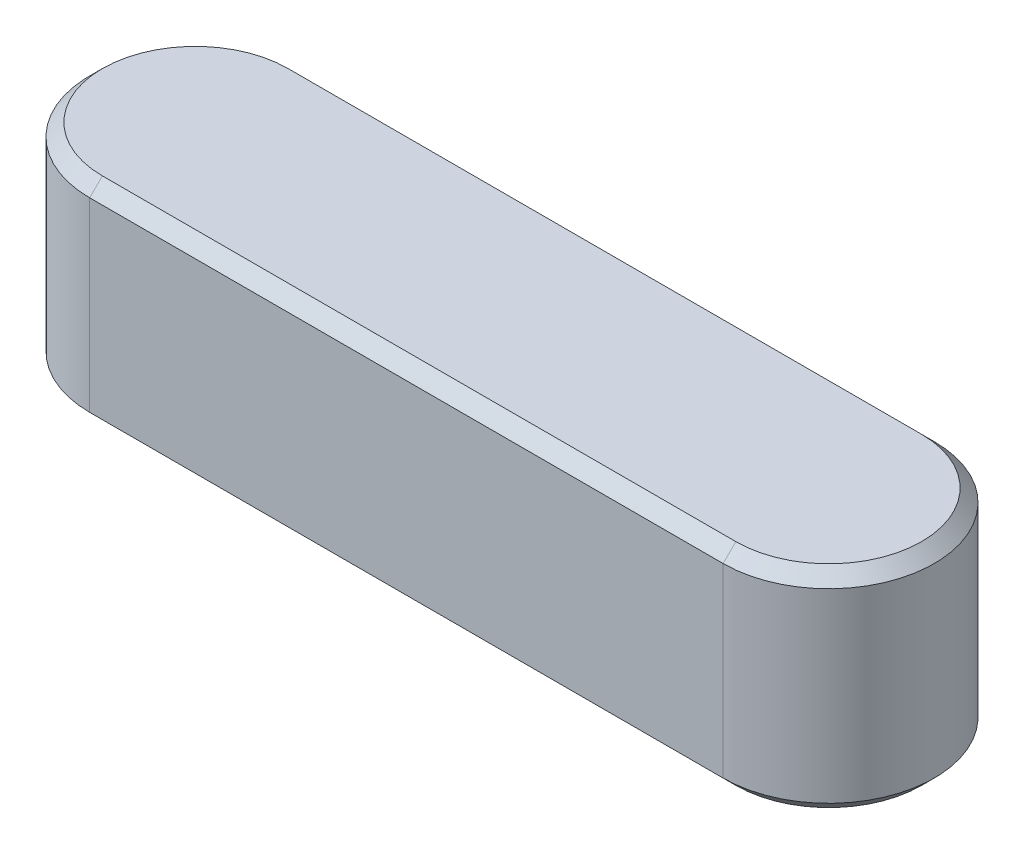
ISO-10303-21;
HEADER;
FILE_DESCRIPTION(('STEP AP214'),'2;1');
FILE_NAME('part.step','',(''),(''),'','','');
FILE_SCHEMA(('AUTOMOTIVE_DESIGN { 1 0 10303 214 1 1 1 1 }'));
ENDSEC;
DATA;
#1=APPLICATION_CONTEXT('core data for automotive mechanical design processes');
#2=APPLICATION_PROTOCOL_DEFINITION('international standard','automotive_design',2000,#1);
#3=PRODUCT_CONTEXT('',#1,'mechanical');
#4=PRODUCT('Part','Part','',(#3));
#5=PRODUCT_RELATED_PRODUCT_CATEGORY('part','',(#4));
#6=PRODUCT_DEFINITION_FORMATION('','',#4);
#7=PRODUCT_DEFINITION_CONTEXT('part definition',#1,'design');
#8=PRODUCT_DEFINITION('design','',#6,#7);
#9=PRODUCT_DEFINITION_SHAPE('','',#8);
#10=(LENGTH_UNIT() NAMED_UNIT(*) SI_UNIT(.MILLI.,.METRE.));
#11=(NAMED_UNIT(*) PLANE_ANGLE_UNIT() SI_UNIT($,.RADIAN.));
#12=(NAMED_UNIT(*) SI_UNIT($,.STERADIAN.) SOLID_ANGLE_UNIT());
#13=UNCERTAINTY_MEASURE_WITH_UNIT(LENGTH_MEASURE(1.E-05),#10,'distance_accuracy_value','');
#14=(GEOMETRIC_REPRESENTATION_CONTEXT(3) GLOBAL_UNCERTAINTY_ASSIGNED_CONTEXT((#13)) GLOBAL_UNIT_ASSIGNED_CONTEXT((#10,
#11,#12)) REPRESENTATION_CONTEXT('',''));
#15=CARTESIAN_POINT('',(0.,0.,0.));
#16=DIRECTION('',(0.,0.,1.));
#17=DIRECTION('',(1.,0.,0.));
#18=AXIS2_PLACEMENT_3D('',#15,#16,#17);
#19=CARTESIAN_POINT('',(0.,5.,0.));
#20=DIRECTION('',(0.,-1.,0.));
#21=DIRECTION('',(0.,0.,-1.));
#22=AXIS2_PLACEMENT_3D('',#19,#20,#21);
#23=CYLINDRICAL_SURFACE('',#22,2.5);
#24=DIRECTION('',(0.,-1.,0.));
#25=VECTOR('',#24,1.);
#26=CARTESIAN_POINT('',(0.,5.,-2.5));
#27=LINE('',#26,#25);
#28=CARTESIAN_POINT('',(0.,4.7,-2.5));
#29=VERTEX_POINT('',#28);
#30=CARTESIAN_POINT('',(0.,0.299999999999999,-2.5));
#31=VERTEX_POINT('',#30);
#32=EDGE_CURVE('E142',#29,#31,#27,.T.);
#33=ORIENTED_EDGE('',*,*,#32,.T.);
#34=CARTESIAN_POINT('',(0.,0.299999999999999,0.));
#35=DIRECTION('',(0.,1.,0.));
#36=DIRECTION('',(0.,0.,1.));
#37=AXIS2_PLACEMENT_3D('',#34,#35,#36);
#38=CIRCLE('',#37,2.5);
#39=CARTESIAN_POINT('',(0.,0.299999999999999,2.5));
#40=VERTEX_POINT('',#39);
#41=EDGE_CURVE('E151',#31,#40,#38,.T.);
#42=ORIENTED_EDGE('',*,*,#41,.T.);
#43=DIRECTION('',(0.,-1.,0.));
#44=VECTOR('',#43,1.);
#45=CARTESIAN_POINT('',(0.,5.,2.5));
#46=LINE('',#45,#44);
#47=CARTESIAN_POINT('',(0.,4.7,2.5));
#48=VERTEX_POINT('',#47);
#49=EDGE_CURVE('E120',#48,#40,#46,.T.);
#50=ORIENTED_EDGE('',*,*,#49,.F.);
#51=CARTESIAN_POINT('',(0.,4.7,0.));
#52=DIRECTION('',(0.,1.,0.));
#53=DIRECTION('',(0.,0.,1.));
#54=AXIS2_PLACEMENT_3D('',#51,#52,#53);
#55=CIRCLE('',#54,2.5);
#56=EDGE_CURVE('E153',#48,#29,#55,.F.);
#57=ORIENTED_EDGE('',*,*,#56,.T.);
#58=EDGE_LOOP('',(#33,#42,#50,#57));
#59=FACE_BOUND('',#58,.T.);
#60=ADVANCED_FACE('F33',(#59),#23,.T.);
#61=CARTESIAN_POINT('',(0.,5.,2.5));
#62=DIRECTION('',(0.,0.,-1.));
#63=DIRECTION('',(-1.,0.,0.));
#64=AXIS2_PLACEMENT_3D('',#61,#62,#63);
#65=PLANE('',#64);
#66=ORIENTED_EDGE('',*,*,#49,.T.);
#67=DIRECTION('',(1.,0.,0.));
#68=VECTOR('',#67,1.);
#69=CARTESIAN_POINT('',(0.,0.299999999999999,2.5));
#70=LINE('',#69,#68);
#71=CARTESIAN_POINT('',(15.,0.299999999999999,2.5));
#72=VERTEX_POINT('',#71);
#73=EDGE_CURVE('E119',#40,#72,#70,.T.);
#74=ORIENTED_EDGE('',*,*,#73,.T.);
#75=DIRECTION('',(0.,-1.,0.));
#76=VECTOR('',#75,1.);
#77=CARTESIAN_POINT('',(15.,5.,2.5));
#78=LINE('',#77,#76);
#79=CARTESIAN_POINT('',(15.,4.7,2.5));
#80=VERTEX_POINT('',#79);
#81=EDGE_CURVE('E102',#80,#72,#78,.T.);
#82=ORIENTED_EDGE('',*,*,#81,.F.);
#83=DIRECTION('',(-1.,0.,0.));
#84=VECTOR('',#83,1.);
#85=CARTESIAN_POINT('',(0.,4.7,2.5));
#86=LINE('',#85,#84);
#87=EDGE_CURVE('E116',#80,#48,#86,.T.);
#88=ORIENTED_EDGE('',*,*,#87,.T.);
#89=EDGE_LOOP('',(#66,#74,#82,#88));
#90=FACE_BOUND('',#89,.T.);
#91=ADVANCED_FACE('F115',(#90),#65,.F.);
#92=CARTESIAN_POINT('',(15.,5.,0.));
#93=DIRECTION('',(0.,-1.,0.));
#94=DIRECTION('',(0.,0.,-1.));
#95=AXIS2_PLACEMENT_3D('',#92,#93,#94);
#96=CYLINDRICAL_SURFACE('',#95,2.5);
#97=ORIENTED_EDGE('',*,*,#81,.T.);
#98=CARTESIAN_POINT('',(15.,0.299999999999999,0.));
#99=DIRECTION('',(0.,1.,0.));
#100=DIRECTION('',(0.,0.,1.));
#101=AXIS2_PLACEMENT_3D('',#98,#99,#100);
#102=CIRCLE('',#101,2.5);
#103=CARTESIAN_POINT('',(15.,0.299999999999999,-2.5));
#104=VERTEX_POINT('',#103);
#105=EDGE_CURVE('E108',#72,#104,#102,.T.);
#106=ORIENTED_EDGE('',*,*,#105,.T.);
#107=DIRECTION('',(0.,-1.,0.));
#108=VECTOR('',#107,1.);
#109=CARTESIAN_POINT('',(15.,5.,-2.5));
#110=LINE('',#109,#108);
#111=CARTESIAN_POINT('',(15.,4.7,-2.5));
#112=VERTEX_POINT('',#111);
#113=EDGE_CURVE('E104',#112,#104,#110,.T.);
#114=ORIENTED_EDGE('',*,*,#113,.F.);
#115=CARTESIAN_POINT('',(15.,4.7,0.));
#116=DIRECTION('',(0.,1.,0.));
#117=DIRECTION('',(0.,0.,1.));
#118=AXIS2_PLACEMENT_3D('',#115,#116,#117);
#119=CIRCLE('',#118,2.5);
#120=EDGE_CURVE('E99',#112,#80,#119,.F.);
#121=ORIENTED_EDGE('',*,*,#120,.T.);
#122=EDGE_LOOP('',(#97,#106,#114,#121));
#123=FACE_BOUND('',#122,.T.);
#124=ADVANCED_FACE('F101',(#123),#96,.T.);
#125=CARTESIAN_POINT('',(0.,5.,-2.5));
#126=DIRECTION('',(0.,0.,1.));
#127=DIRECTION('',(1.,0.,0.));
#128=AXIS2_PLACEMENT_3D('',#125,#126,#127);
#129=PLANE('',#128);
#130=ORIENTED_EDGE('',*,*,#113,.T.);
#131=DIRECTION('',(-1.,0.,0.));
#132=VECTOR('',#131,1.);
#133=CARTESIAN_POINT('',(0.,0.299999999999999,-2.5));
#134=LINE('',#133,#132);
#135=EDGE_CURVE('E155',#104,#31,#134,.T.);
#136=ORIENTED_EDGE('',*,*,#135,.T.);
#137=ORIENTED_EDGE('',*,*,#32,.F.);
#138=DIRECTION('',(1.,0.,0.));
#139=VECTOR('',#138,1.);
#140=CARTESIAN_POINT('',(15.,4.7,-2.5));
#141=LINE('',#140,#139);
#142=EDGE_CURVE('E157',#29,#112,#141,.T.);
#143=ORIENTED_EDGE('',*,*,#142,.T.);
#144=EDGE_LOOP('',(#130,#136,#137,#143));
#145=FACE_BOUND('',#144,.T.);
#146=ADVANCED_FACE('F195',(#145),#129,.F.);
#147=CARTESIAN_POINT('',(0.,5.,0.));
#148=DIRECTION('',(0.,1.,0.));
#149=DIRECTION('',(0.,0.,1.));
#150=AXIS2_PLACEMENT_3D('',#147,#148,#149);
#151=PLANE('',#150);
#152=CARTESIAN_POINT('',(15.,5.,0.));
#153=DIRECTION('',(0.,1.,0.));
#154=DIRECTION('',(0.,0.,1.));
#155=AXIS2_PLACEMENT_3D('',#152,#153,#154);
#156=CIRCLE('',#155,2.2);
#157=CARTESIAN_POINT('',(15.,5.,2.2));
#158=VERTEX_POINT('',#157);
#159=CARTESIAN_POINT('',(15.,5.,-2.2));
#160=VERTEX_POINT('',#159);
#161=EDGE_CURVE('E42',#158,#160,#156,.T.);
#162=ORIENTED_EDGE('',*,*,#161,.T.);
#163=DIRECTION('',(-1.,0.,0.));
#164=VECTOR('',#163,1.);
#165=CARTESIAN_POINT('',(0.,5.,-2.2));
#166=LINE('',#165,#164);
#167=CARTESIAN_POINT('',(0.,5.,-2.2));
#168=VERTEX_POINT('',#167);
#169=EDGE_CURVE('E11',#160,#168,#166,.T.);
#170=ORIENTED_EDGE('',*,*,#169,.T.);
#171=CARTESIAN_POINT('',(0.,5.,0.));
#172=DIRECTION('',(0.,1.,0.));
#173=DIRECTION('',(0.,0.,1.));
#174=AXIS2_PLACEMENT_3D('',#171,#172,#173);
#175=CIRCLE('',#174,2.2);
#176=CARTESIAN_POINT('',(0.,5.,2.2));
#177=VERTEX_POINT('',#176);
#178=EDGE_CURVE('E149',#168,#177,#175,.T.);
#179=ORIENTED_EDGE('',*,*,#178,.T.);
#180=DIRECTION('',(1.,0.,0.));
#181=VECTOR('',#180,1.);
#182=CARTESIAN_POINT('',(15.,5.,2.2));
#183=LINE('',#182,#181);
#184=EDGE_CURVE('E53',#177,#158,#183,.T.);
#185=ORIENTED_EDGE('',*,*,#184,.T.);
#186=EDGE_LOOP('',(#162,#170,#179,#185));
#187=FACE_BOUND('',#186,.T.);
#188=ADVANCED_FACE('F201',(#187),#151,.T.);
#189=CARTESIAN_POINT('',(0.,0.,0.));
#190=DIRECTION('',(0.,1.,0.));
#191=DIRECTION('',(0.,0.,1.));
#192=AXIS2_PLACEMENT_3D('',#189,#190,#191);
#193=PLANE('',#192);
#194=CARTESIAN_POINT('',(15.,0.,0.));
#195=DIRECTION('',(0.,1.,0.));
#196=DIRECTION('',(0.,0.,1.));
#197=AXIS2_PLACEMENT_3D('',#194,#195,#196);
#198=CIRCLE('',#197,2.2);
#199=CARTESIAN_POINT('',(15.,0.,-2.2));
#200=VERTEX_POINT('',#199);
#201=CARTESIAN_POINT('',(15.,0.,2.2));
#202=VERTEX_POINT('',#201);
#203=EDGE_CURVE('E162',#200,#202,#198,.F.);
#204=ORIENTED_EDGE('',*,*,#203,.T.);
#205=DIRECTION('',(-1.,0.,0.));
#206=VECTOR('',#205,1.);
#207=CARTESIAN_POINT('',(0.,0.,2.2));
#208=LINE('',#207,#206);
#209=CARTESIAN_POINT('',(0.,0.,2.2));
#210=VERTEX_POINT('',#209);
#211=EDGE_CURVE('E109',#202,#210,#208,.T.);
#212=ORIENTED_EDGE('',*,*,#211,.T.);
#213=CARTESIAN_POINT('',(0.,0.,0.));
#214=DIRECTION('',(0.,1.,0.));
#215=DIRECTION('',(0.,0.,1.));
#216=AXIS2_PLACEMENT_3D('',#213,#214,#215);
#217=CIRCLE('',#216,2.2);
#218=CARTESIAN_POINT('',(0.,0.,-2.2));
#219=VERTEX_POINT('',#218);
#220=EDGE_CURVE('E166',#210,#219,#217,.F.);
#221=ORIENTED_EDGE('',*,*,#220,.T.);
#222=DIRECTION('',(1.,0.,0.));
#223=VECTOR('',#222,1.);
#224=CARTESIAN_POINT('',(0.,0.,-2.2));
#225=LINE('',#224,#223);
#226=EDGE_CURVE('E164',#219,#200,#225,.T.);
#227=ORIENTED_EDGE('',*,*,#226,.T.);
#228=EDGE_LOOP('',(#204,#212,#221,#227));
#229=FACE_BOUND('',#228,.T.);
#230=ADVANCED_FACE('F203',(#229),#193,.F.);
#231=CARTESIAN_POINT('',(0.,0.299999999999999,-2.5));
#232=DIRECTION('',(0.,0.70710678118655,0.707106781186545));
#233=DIRECTION('',(-1.,0.,0.));
#234=AXIS2_PLACEMENT_3D('',#231,#232,#233);
#235=PLANE('',#234);
#236=DIRECTION('',(0.,0.707106781186545,-0.70710678118655));
#237=VECTOR('',#236,1.);
#238=CARTESIAN_POINT('',(15.,0.,-2.2));
#239=LINE('',#238,#237);
#240=EDGE_CURVE('E143',#200,#104,#239,.T.);
#241=ORIENTED_EDGE('',*,*,#240,.F.);
#242=ORIENTED_EDGE('',*,*,#226,.F.);
#243=DIRECTION('',(0.,-0.707106781186545,0.70710678118655));
#244=VECTOR('',#243,1.);
#245=CARTESIAN_POINT('',(0.,0.299999999999999,-2.5));
#246=LINE('',#245,#244);
#247=EDGE_CURVE('E139',#31,#219,#246,.T.);
#248=ORIENTED_EDGE('',*,*,#247,.F.);
#249=ORIENTED_EDGE('',*,*,#135,.F.);
#250=EDGE_LOOP('',(#241,#242,#248,#249));
#251=FACE_BOUND('',#250,.T.);
#252=ADVANCED_FACE('F182',(#251),#235,.F.);
#253=CARTESIAN_POINT('',(0.,0.299999999999999,0.));
#254=DIRECTION('',(0.,1.,0.));
#255=DIRECTION('',(0.,0.,1.));
#256=AXIS2_PLACEMENT_3D('',#253,#254,#255);
#257=CONICAL_SURFACE('',#256,2.5,0.785398163397452);
#258=ORIENTED_EDGE('',*,*,#247,.T.);
#259=ORIENTED_EDGE('',*,*,#220,.F.);
#260=DIRECTION('',(0.,-0.707106781186545,-0.70710678118655));
#261=VECTOR('',#260,1.);
#262=CARTESIAN_POINT('',(0.,0.299999999999999,2.5));
#263=LINE('',#262,#261);
#264=EDGE_CURVE('E130',#40,#210,#263,.T.);
#265=ORIENTED_EDGE('',*,*,#264,.F.);
#266=ORIENTED_EDGE('',*,*,#41,.F.);
#267=EDGE_LOOP('',(#258,#259,#265,#266));
#268=FACE_BOUND('',#267,.T.);
#269=ADVANCED_FACE('F186',(#268),#257,.T.);
#270=CARTESIAN_POINT('',(15.,0.299999999999999,0.));
#271=DIRECTION('',(0.,1.,0.));
#272=DIRECTION('',(0.,0.,1.));
#273=AXIS2_PLACEMENT_3D('',#270,#271,#272);
#274=CONICAL_SURFACE('',#273,2.5,0.785398163397452);
#275=ORIENTED_EDGE('',*,*,#240,.T.);
#276=ORIENTED_EDGE('',*,*,#105,.F.);
#277=DIRECTION('',(0.,0.707106781186545,0.70710678118655));
#278=VECTOR('',#277,1.);
#279=CARTESIAN_POINT('',(15.,0.,2.2));
#280=LINE('',#279,#278);
#281=EDGE_CURVE('E129',#202,#72,#280,.T.);
#282=ORIENTED_EDGE('',*,*,#281,.F.);
#283=ORIENTED_EDGE('',*,*,#203,.F.);
#284=EDGE_LOOP('',(#275,#276,#282,#283));
#285=FACE_BOUND('',#284,.T.);
#286=ADVANCED_FACE('F194',(#285),#274,.T.);
#287=CARTESIAN_POINT('',(0.,0.299999999999999,2.5));
#288=DIRECTION('',(0.,0.70710678118655,-0.707106781186545));
#289=DIRECTION('',(1.,0.,0.));
#290=AXIS2_PLACEMENT_3D('',#287,#288,#289);
#291=PLANE('',#290);
#292=ORIENTED_EDGE('',*,*,#264,.T.);
#293=ORIENTED_EDGE('',*,*,#211,.F.);
#294=ORIENTED_EDGE('',*,*,#281,.T.);
#295=ORIENTED_EDGE('',*,*,#73,.F.);
#296=EDGE_LOOP('',(#292,#293,#294,#295));
#297=FACE_BOUND('',#296,.T.);
#298=ADVANCED_FACE('F189',(#297),#291,.F.);
#299=CARTESIAN_POINT('',(0.,5.,2.2));
#300=DIRECTION('',(0.,0.707106781186545,0.70710678118655));
#301=DIRECTION('',(-1.,0.,0.));
#302=AXIS2_PLACEMENT_3D('',#299,#300,#301);
#303=PLANE('',#302);
#304=DIRECTION('',(0.,0.70710678118655,-0.707106781186545));
#305=VECTOR('',#304,1.);
#306=CARTESIAN_POINT('',(0.,4.7,2.5));
#307=LINE('',#306,#305);
#308=EDGE_CURVE('E125',#48,#177,#307,.T.);
#309=ORIENTED_EDGE('',*,*,#308,.F.);
#310=ORIENTED_EDGE('',*,*,#87,.F.);
#311=DIRECTION('',(0.,-0.70710678118655,0.707106781186545));
#312=VECTOR('',#311,1.);
#313=CARTESIAN_POINT('',(15.,5.,2.2));
#314=LINE('',#313,#312);
#315=EDGE_CURVE('E37',#158,#80,#314,.T.);
#316=ORIENTED_EDGE('',*,*,#315,.F.);
#317=ORIENTED_EDGE('',*,*,#184,.F.);
#318=EDGE_LOOP('',(#309,#310,#316,#317));
#319=FACE_BOUND('',#318,.T.);
#320=ADVANCED_FACE('F35',(#319),#303,.T.);
#321=CARTESIAN_POINT('',(15.,5.,0.));
#322=DIRECTION('',(0.,-1.,0.));
#323=DIRECTION('',(0.,0.,-1.));
#324=AXIS2_PLACEMENT_3D('',#321,#322,#323);
#325=CONICAL_SURFACE('',#324,2.2,0.785398163397445);
#326=ORIENTED_EDGE('',*,*,#315,.T.);
#327=ORIENTED_EDGE('',*,*,#120,.F.);
#328=DIRECTION('',(0.,-0.70710678118655,-0.707106781186545));
#329=VECTOR('',#328,1.);
#330=CARTESIAN_POINT('',(15.,5.,-2.2));
#331=LINE('',#330,#329);
#332=EDGE_CURVE('E132',#160,#112,#331,.T.);
#333=ORIENTED_EDGE('',*,*,#332,.F.);
#334=ORIENTED_EDGE('',*,*,#161,.F.);
#335=EDGE_LOOP('',(#326,#327,#333,#334));
#336=FACE_BOUND('',#335,.T.);
#337=ADVANCED_FACE('F128',(#336),#325,.T.);
#338=CARTESIAN_POINT('',(0.,5.,0.));
#339=DIRECTION('',(0.,-1.,0.));
#340=DIRECTION('',(0.,0.,-1.));
#341=AXIS2_PLACEMENT_3D('',#338,#339,#340);
#342=CONICAL_SURFACE('',#341,2.2,0.785398163397445);
#343=ORIENTED_EDGE('',*,*,#308,.T.);
#344=ORIENTED_EDGE('',*,*,#178,.F.);
#345=DIRECTION('',(0.,0.70710678118655,0.707106781186545));
#346=VECTOR('',#345,1.);
#347=CARTESIAN_POINT('',(0.,4.7,-2.5));
#348=LINE('',#347,#346);
#349=EDGE_CURVE('E135',#29,#168,#348,.T.);
#350=ORIENTED_EDGE('',*,*,#349,.F.);
#351=ORIENTED_EDGE('',*,*,#56,.F.);
#352=EDGE_LOOP('',(#343,#344,#350,#351));
#353=FACE_BOUND('',#352,.T.);
#354=ADVANCED_FACE('F200',(#353),#342,.T.);
#355=CARTESIAN_POINT('',(0.,5.,-2.2));
#356=DIRECTION('',(0.,0.707106781186545,-0.70710678118655));
#357=DIRECTION('',(1.,0.,0.));
#358=AXIS2_PLACEMENT_3D('',#355,#356,#357);
#359=PLANE('',#358);
#360=ORIENTED_EDGE('',*,*,#332,.T.);
#361=ORIENTED_EDGE('',*,*,#142,.F.);
#362=ORIENTED_EDGE('',*,*,#349,.T.);
#363=ORIENTED_EDGE('',*,*,#169,.F.);
#364=EDGE_LOOP('',(#360,#361,#362,#363));
#365=FACE_BOUND('',#364,.T.);
#366=ADVANCED_FACE('F198',(#365),#359,.T.);
#367=CLOSED_SHELL('',(#60,#91,#124,#146,#188,#230,#252,#269,#286,#298,#320,#337,#354,#366));
#368=MANIFOLD_SOLID_BREP('B2',#367);
#369=ADVANCED_BREP_SHAPE_REPRESENTATION('',(#18,#368),#14);
#370=SHAPE_DEFINITION_REPRESENTATION(#9,#369);
ENDSEC;
END-ISO-10303-21;
